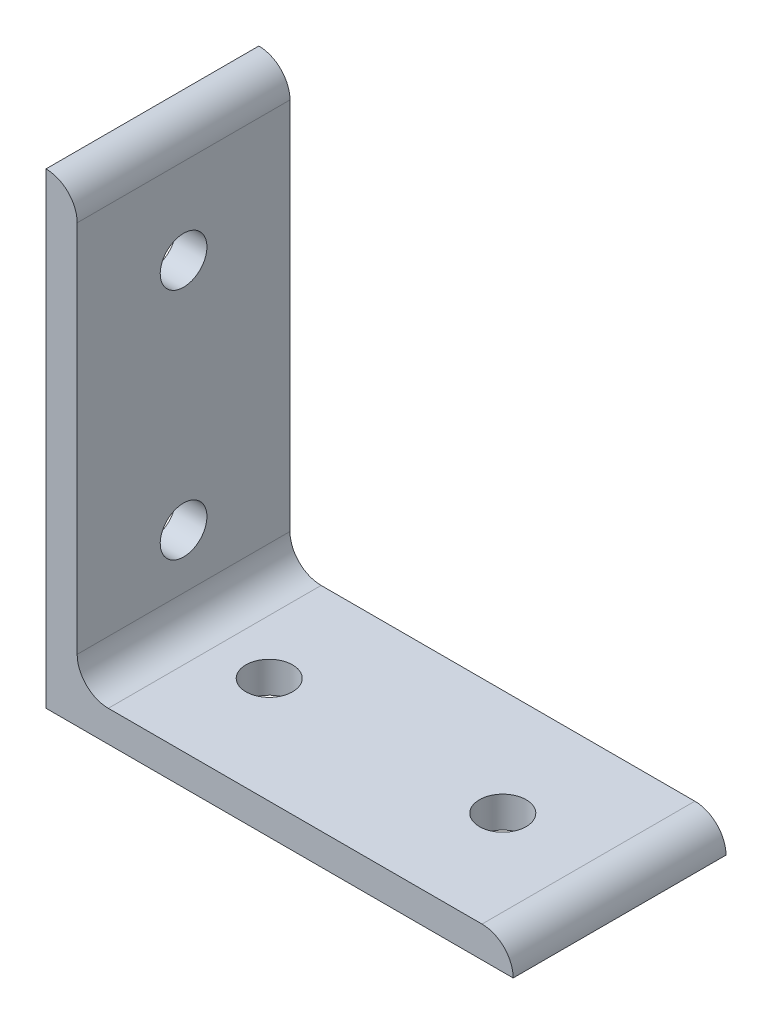
ISO-10303-21;
HEADER;
FILE_DESCRIPTION(('STEP AP214'),'2;1');
FILE_NAME('part.step','',(''),(''),'','','');
FILE_SCHEMA(('AUTOMOTIVE_DESIGN { 1 0 10303 214 1 1 1 1 }'));
ENDSEC;
DATA;
#1=APPLICATION_CONTEXT('core data for automotive mechanical design processes');
#2=APPLICATION_PROTOCOL_DEFINITION('international standard','automotive_design',2000,#1);
#3=PRODUCT_CONTEXT('',#1,'mechanical');
#4=PRODUCT('Part','Part','',(#3));
#5=PRODUCT_RELATED_PRODUCT_CATEGORY('part','',(#4));
#6=PRODUCT_DEFINITION_FORMATION('','',#4);
#7=PRODUCT_DEFINITION_CONTEXT('part definition',#1,'design');
#8=PRODUCT_DEFINITION('design','',#6,#7);
#9=PRODUCT_DEFINITION_SHAPE('','',#8);
#10=(LENGTH_UNIT() NAMED_UNIT(*) SI_UNIT(.MILLI.,.METRE.));
#11=(NAMED_UNIT(*) PLANE_ANGLE_UNIT() SI_UNIT($,.RADIAN.));
#12=(NAMED_UNIT(*) SI_UNIT($,.STERADIAN.) SOLID_ANGLE_UNIT());
#13=UNCERTAINTY_MEASURE_WITH_UNIT(LENGTH_MEASURE(1.E-05),#10,'distance_accuracy_value','');
#14=(GEOMETRIC_REPRESENTATION_CONTEXT(3) GLOBAL_UNCERTAINTY_ASSIGNED_CONTEXT((#13)) GLOBAL_UNIT_ASSIGNED_CONTEXT((#10,
#11,#12)) REPRESENTATION_CONTEXT('',''));
#15=CARTESIAN_POINT('',(0.,0.,0.));
#16=DIRECTION('',(0.,0.,1.));
#17=DIRECTION('',(1.,0.,0.));
#18=AXIS2_PLACEMENT_3D('',#15,#16,#17);
#19=CARTESIAN_POINT('',(5.99999999999999,84.,20.5));
#20=DIRECTION('',(-1.,0.,0.));
#21=DIRECTION('',(0.,-1.,0.));
#22=AXIS2_PLACEMENT_3D('',#19,#20,#21);
#23=PLANE('',#22);
#24=CARTESIAN_POINT('',(6.00000000000001,22.5,0.));
#25=DIRECTION('',(-1.,0.,0.));
#26=DIRECTION('',(0.,-1.,0.));
#27=AXIS2_PLACEMENT_3D('',#24,#25,#26);
#28=CIRCLE('',#27,4.5);
#29=CARTESIAN_POINT('',(6.00000000000001,18.,0.));
#30=VERTEX_POINT('',#29);
#31=EDGE_CURVE('E198',#30,#30,#28,.F.);
#32=ORIENTED_EDGE('',*,*,#31,.F.);
#33=EDGE_LOOP('',(#32));
#34=FACE_BOUND('',#33,.T.);
#35=DIRECTION('',(0.,1.,0.));
#36=VECTOR('',#35,1.);
#37=CARTESIAN_POINT('',(5.99999999999999,84.,-20.5));
#38=LINE('',#37,#36);
#39=CARTESIAN_POINT('',(6.,12.,-20.5));
#40=VERTEX_POINT('',#39);
#41=CARTESIAN_POINT('',(5.99999999999997,84.,-20.5));
#42=VERTEX_POINT('',#41);
#43=EDGE_CURVE('E119',#40,#42,#38,.T.);
#44=ORIENTED_EDGE('',*,*,#43,.T.);
#45=DIRECTION('',(0.,0.,-1.));
#46=VECTOR('',#45,1.);
#47=CARTESIAN_POINT('',(5.99999999999997,84.,20.5));
#48=LINE('',#47,#46);
#49=CARTESIAN_POINT('',(5.99999999999997,84.,20.5));
#50=VERTEX_POINT('',#49);
#51=EDGE_CURVE('E116',#50,#42,#48,.T.);
#52=ORIENTED_EDGE('',*,*,#51,.F.);
#53=DIRECTION('',(0.,1.,0.));
#54=VECTOR('',#53,1.);
#55=CARTESIAN_POINT('',(5.99999999999999,84.,20.5));
#56=LINE('',#55,#54);
#57=CARTESIAN_POINT('',(6.,12.,20.5));
#58=VERTEX_POINT('',#57);
#59=EDGE_CURVE('E105',#58,#50,#56,.T.);
#60=ORIENTED_EDGE('',*,*,#59,.F.);
#61=DIRECTION('',(0.,0.,-1.));
#62=VECTOR('',#61,1.);
#63=CARTESIAN_POINT('',(6.,12.,20.5));
#64=LINE('',#63,#62);
#65=EDGE_CURVE('E120',#58,#40,#64,.T.);
#66=ORIENTED_EDGE('',*,*,#65,.T.);
#67=EDGE_LOOP('',(#44,#52,#60,#66));
#68=FACE_BOUND('',#67,.T.);
#69=CARTESIAN_POINT('',(5.99999999999999,67.5,0.));
#70=DIRECTION('',(-1.,0.,0.));
#71=DIRECTION('',(0.,-1.,0.));
#72=AXIS2_PLACEMENT_3D('',#69,#70,#71);
#73=CIRCLE('',#72,4.5);
#74=CARTESIAN_POINT('',(5.99999999999999,63.,0.));
#75=VERTEX_POINT('',#74);
#76=EDGE_CURVE('E191',#75,#75,#73,.F.);
#77=ORIENTED_EDGE('',*,*,#76,.F.);
#78=EDGE_LOOP('',(#77));
#79=FACE_BOUND('',#78,.T.);
#80=ADVANCED_FACE('F36',(#34,#68,#79),#23,.F.);
#81=CARTESIAN_POINT('',(0.,0.,20.5));
#82=DIRECTION('',(1.,0.,0.));
#83=DIRECTION('',(0.,0.,-1.));
#84=AXIS2_PLACEMENT_3D('',#81,#82,#83);
#85=PLANE('',#84);
#86=CARTESIAN_POINT('',(0.,22.5,0.));
#87=DIRECTION('',(1.,0.,0.));
#88=DIRECTION('',(0.,0.,-1.));
#89=AXIS2_PLACEMENT_3D('',#86,#87,#88);
#90=CIRCLE('',#89,4.5);
#91=CARTESIAN_POINT('',(0.,22.5,-4.5));
#92=VERTEX_POINT('',#91);
#93=EDGE_CURVE('E194',#92,#92,#90,.T.);
#94=ORIENTED_EDGE('',*,*,#93,.T.);
#95=EDGE_LOOP('',(#94));
#96=FACE_BOUND('',#95,.T.);
#97=DIRECTION('',(0.,-1.,0.));
#98=VECTOR('',#97,1.);
#99=CARTESIAN_POINT('',(0.,0.,-20.5));
#100=LINE('',#99,#98);
#101=CARTESIAN_POINT('',(0.,90.,-20.5));
#102=VERTEX_POINT('',#101);
#103=CARTESIAN_POINT('',(0.,0.,-20.5));
#104=VERTEX_POINT('',#103);
#105=EDGE_CURVE('E87',#102,#104,#100,.T.);
#106=ORIENTED_EDGE('',*,*,#105,.T.);
#107=DIRECTION('',(0.,0.,-1.));
#108=VECTOR('',#107,1.);
#109=CARTESIAN_POINT('',(0.,0.,20.5));
#110=LINE('',#109,#108);
#111=CARTESIAN_POINT('',(0.,0.,20.5));
#112=VERTEX_POINT('',#111);
#113=EDGE_CURVE('E125',#112,#104,#110,.T.);
#114=ORIENTED_EDGE('',*,*,#113,.F.);
#115=DIRECTION('',(0.,-1.,0.));
#116=VECTOR('',#115,1.);
#117=CARTESIAN_POINT('',(0.,0.,20.5));
#118=LINE('',#117,#116);
#119=CARTESIAN_POINT('',(0.,90.,20.5));
#120=VERTEX_POINT('',#119);
#121=EDGE_CURVE('E55',#120,#112,#118,.T.);
#122=ORIENTED_EDGE('',*,*,#121,.F.);
#123=DIRECTION('',(0.,0.,-1.));
#124=VECTOR('',#123,1.);
#125=CARTESIAN_POINT('',(0.,90.,20.5));
#126=LINE('',#125,#124);
#127=EDGE_CURVE('E121',#120,#102,#126,.T.);
#128=ORIENTED_EDGE('',*,*,#127,.T.);
#129=EDGE_LOOP('',(#106,#114,#122,#128));
#130=FACE_BOUND('',#129,.T.);
#131=CARTESIAN_POINT('',(0.,67.5,0.));
#132=DIRECTION('',(1.,0.,0.));
#133=DIRECTION('',(0.,0.,-1.));
#134=AXIS2_PLACEMENT_3D('',#131,#132,#133);
#135=CIRCLE('',#134,4.5);
#136=CARTESIAN_POINT('',(0.,67.5,-4.5));
#137=VERTEX_POINT('',#136);
#138=EDGE_CURVE('E189',#137,#137,#135,.T.);
#139=ORIENTED_EDGE('',*,*,#138,.T.);
#140=EDGE_LOOP('',(#139));
#141=FACE_BOUND('',#140,.T.);
#142=ADVANCED_FACE('F182',(#96,#130,#141),#85,.F.);
#143=CARTESIAN_POINT('',(90.,0.,20.5));
#144=DIRECTION('',(0.,1.,0.));
#145=DIRECTION('',(-1.,0.,0.));
#146=AXIS2_PLACEMENT_3D('',#143,#144,#145);
#147=PLANE('',#146);
#148=CARTESIAN_POINT('',(22.5,0.,0.));
#149=DIRECTION('',(0.,1.,0.));
#150=DIRECTION('',(0.,0.,1.));
#151=AXIS2_PLACEMENT_3D('',#148,#149,#150);
#152=CIRCLE('',#151,4.5);
#153=CARTESIAN_POINT('',(22.5,0.,-4.5));
#154=VERTEX_POINT('',#153);
#155=EDGE_CURVE('E151',#154,#154,#152,.T.);
#156=ORIENTED_EDGE('',*,*,#155,.T.);
#157=EDGE_LOOP('',(#156));
#158=FACE_BOUND('',#157,.T.);
#159=DIRECTION('',(1.,0.,0.));
#160=VECTOR('',#159,1.);
#161=CARTESIAN_POINT('',(90.,0.,-20.5));
#162=LINE('',#161,#160);
#163=CARTESIAN_POINT('',(90.,0.,-20.5));
#164=VERTEX_POINT('',#163);
#165=EDGE_CURVE('E129',#104,#164,#162,.T.);
#166=ORIENTED_EDGE('',*,*,#165,.T.);
#167=DIRECTION('',(0.,0.,-1.));
#168=VECTOR('',#167,1.);
#169=CARTESIAN_POINT('',(90.,0.,20.5));
#170=LINE('',#169,#168);
#171=CARTESIAN_POINT('',(90.,0.,20.5));
#172=VERTEX_POINT('',#171);
#173=EDGE_CURVE('E11',#172,#164,#170,.T.);
#174=ORIENTED_EDGE('',*,*,#173,.F.);
#175=DIRECTION('',(1.,0.,0.));
#176=VECTOR('',#175,1.);
#177=CARTESIAN_POINT('',(90.,0.,20.5));
#178=LINE('',#177,#176);
#179=EDGE_CURVE('E142',#112,#172,#178,.T.);
#180=ORIENTED_EDGE('',*,*,#179,.F.);
#181=ORIENTED_EDGE('',*,*,#113,.T.);
#182=EDGE_LOOP('',(#166,#174,#180,#181));
#183=FACE_BOUND('',#182,.T.);
#184=CARTESIAN_POINT('',(67.5,0.,0.));
#185=DIRECTION('',(0.,1.,0.));
#186=DIRECTION('',(0.,0.,1.));
#187=AXIS2_PLACEMENT_3D('',#184,#185,#186);
#188=CIRCLE('',#187,4.5);
#189=CARTESIAN_POINT('',(67.5,0.,-4.5));
#190=VERTEX_POINT('',#189);
#191=EDGE_CURVE('E159',#190,#190,#188,.T.);
#192=ORIENTED_EDGE('',*,*,#191,.T.);
#193=EDGE_LOOP('',(#192));
#194=FACE_BOUND('',#193,.T.);
#195=ADVANCED_FACE('F38',(#158,#183,#194),#147,.F.);
#196=CARTESIAN_POINT('',(12.,6.00000000000001,20.5));
#197=DIRECTION('',(0.,-1.,0.));
#198=DIRECTION('',(1.,0.,0.));
#199=AXIS2_PLACEMENT_3D('',#196,#197,#198);
#200=PLANE('',#199);
#201=CARTESIAN_POINT('',(22.5,6.00000000000001,0.));
#202=DIRECTION('',(0.,-1.,0.));
#203=DIRECTION('',(1.,0.,0.));
#204=AXIS2_PLACEMENT_3D('',#201,#202,#203);
#205=CIRCLE('',#204,4.5);
#206=CARTESIAN_POINT('',(22.5,6.00000000000001,-4.5));
#207=VERTEX_POINT('',#206);
#208=EDGE_CURVE('E133',#207,#207,#205,.F.);
#209=ORIENTED_EDGE('',*,*,#208,.F.);
#210=EDGE_LOOP('',(#209));
#211=FACE_BOUND('',#210,.T.);
#212=DIRECTION('',(-1.,0.,0.));
#213=VECTOR('',#212,1.);
#214=CARTESIAN_POINT('',(12.,6.00000000000001,-20.5));
#215=LINE('',#214,#213);
#216=CARTESIAN_POINT('',(84.,6.00000000000001,-20.5));
#217=VERTEX_POINT('',#216);
#218=CARTESIAN_POINT('',(12.,6.00000000000001,-20.5));
#219=VERTEX_POINT('',#218);
#220=EDGE_CURVE('E135',#217,#219,#215,.T.);
#221=ORIENTED_EDGE('',*,*,#220,.T.);
#222=DIRECTION('',(0.,0.,-1.));
#223=VECTOR('',#222,1.);
#224=CARTESIAN_POINT('',(12.,6.00000000000001,20.5));
#225=LINE('',#224,#223);
#226=CARTESIAN_POINT('',(12.,6.00000000000001,20.5));
#227=VERTEX_POINT('',#226);
#228=EDGE_CURVE('E146',#227,#219,#225,.T.);
#229=ORIENTED_EDGE('',*,*,#228,.F.);
#230=DIRECTION('',(-1.,0.,0.));
#231=VECTOR('',#230,1.);
#232=CARTESIAN_POINT('',(12.,6.00000000000001,20.5));
#233=LINE('',#232,#231);
#234=CARTESIAN_POINT('',(84.,6.00000000000001,20.5));
#235=VERTEX_POINT('',#234);
#236=EDGE_CURVE('E165',#235,#227,#233,.T.);
#237=ORIENTED_EDGE('',*,*,#236,.F.);
#238=DIRECTION('',(0.,0.,-1.));
#239=VECTOR('',#238,1.);
#240=CARTESIAN_POINT('',(84.,6.00000000000001,20.5));
#241=LINE('',#240,#239);
#242=EDGE_CURVE('E46',#235,#217,#241,.T.);
#243=ORIENTED_EDGE('',*,*,#242,.T.);
#244=EDGE_LOOP('',(#221,#229,#237,#243));
#245=FACE_BOUND('',#244,.T.);
#246=CARTESIAN_POINT('',(67.5,6.00000000000001,0.));
#247=DIRECTION('',(0.,-1.,0.));
#248=DIRECTION('',(1.,0.,0.));
#249=AXIS2_PLACEMENT_3D('',#246,#247,#248);
#250=CIRCLE('',#249,4.5);
#251=CARTESIAN_POINT('',(67.5,6.00000000000001,-4.5));
#252=VERTEX_POINT('',#251);
#253=EDGE_CURVE('E40',#252,#252,#250,.F.);
#254=ORIENTED_EDGE('',*,*,#253,.F.);
#255=EDGE_LOOP('',(#254));
#256=FACE_BOUND('',#255,.T.);
#257=ADVANCED_FACE('F169',(#211,#245,#256),#200,.F.);
#258=CARTESIAN_POINT('',(84.,0.,20.5));
#259=DIRECTION('',(0.,0.,-1.));
#260=DIRECTION('',(-1.,0.,0.));
#261=AXIS2_PLACEMENT_3D('',#258,#259,#260);
#262=CYLINDRICAL_SURFACE('',#261,5.99999999999998);
#263=CARTESIAN_POINT('',(84.,0.,-20.5));
#264=DIRECTION('',(0.,0.,1.));
#265=DIRECTION('',(1.,0.,0.));
#266=AXIS2_PLACEMENT_3D('',#263,#264,#265);
#267=CIRCLE('',#266,5.99999999999998);
#268=EDGE_CURVE('E132',#164,#217,#267,.T.);
#269=ORIENTED_EDGE('',*,*,#268,.T.);
#270=ORIENTED_EDGE('',*,*,#242,.F.);
#271=CARTESIAN_POINT('',(84.,0.,20.5));
#272=DIRECTION('',(0.,0.,1.));
#273=DIRECTION('',(1.,0.,0.));
#274=AXIS2_PLACEMENT_3D('',#271,#272,#273);
#275=CIRCLE('',#274,5.99999999999998);
#276=EDGE_CURVE('E95',#172,#235,#275,.T.);
#277=ORIENTED_EDGE('',*,*,#276,.F.);
#278=ORIENTED_EDGE('',*,*,#173,.T.);
#279=EDGE_LOOP('',(#269,#270,#277,#278));
#280=FACE_BOUND('',#279,.T.);
#281=ADVANCED_FACE('F213',(#280),#262,.T.);
#282=CARTESIAN_POINT('',(12.,12.,20.5));
#283=DIRECTION('',(0.,0.,-1.));
#284=DIRECTION('',(-1.,0.,0.));
#285=AXIS2_PLACEMENT_3D('',#282,#283,#284);
#286=CYLINDRICAL_SURFACE('',#285,6.);
#287=CARTESIAN_POINT('',(12.,12.,-20.5));
#288=DIRECTION('',(0.,0.,-1.));
#289=DIRECTION('',(1.,0.,0.));
#290=AXIS2_PLACEMENT_3D('',#287,#288,#289);
#291=CIRCLE('',#290,6.);
#292=EDGE_CURVE('E137',#219,#40,#291,.T.);
#293=ORIENTED_EDGE('',*,*,#292,.T.);
#294=ORIENTED_EDGE('',*,*,#65,.F.);
#295=CARTESIAN_POINT('',(12.,12.,20.5));
#296=DIRECTION('',(0.,0.,-1.));
#297=DIRECTION('',(1.,0.,0.));
#298=AXIS2_PLACEMENT_3D('',#295,#296,#297);
#299=CIRCLE('',#298,6.);
#300=EDGE_CURVE('E111',#227,#58,#299,.T.);
#301=ORIENTED_EDGE('',*,*,#300,.F.);
#302=ORIENTED_EDGE('',*,*,#228,.T.);
#303=EDGE_LOOP('',(#293,#294,#301,#302));
#304=FACE_BOUND('',#303,.T.);
#305=ADVANCED_FACE('F174',(#304),#286,.F.);
#306=CARTESIAN_POINT('',(0.,84.,20.5));
#307=DIRECTION('',(0.,0.,-1.));
#308=DIRECTION('',(-1.,0.,0.));
#309=AXIS2_PLACEMENT_3D('',#306,#307,#308);
#310=CYLINDRICAL_SURFACE('',#309,5.99999999999998);
#311=CARTESIAN_POINT('',(0.,84.,-20.5));
#312=DIRECTION('',(0.,0.,1.));
#313=DIRECTION('',(1.,0.,0.));
#314=AXIS2_PLACEMENT_3D('',#311,#312,#313);
#315=CIRCLE('',#314,5.99999999999998);
#316=EDGE_CURVE('E81',#42,#102,#315,.T.);
#317=ORIENTED_EDGE('',*,*,#316,.T.);
#318=ORIENTED_EDGE('',*,*,#127,.F.);
#319=CARTESIAN_POINT('',(0.,84.,20.5));
#320=DIRECTION('',(0.,0.,1.));
#321=DIRECTION('',(1.,0.,0.));
#322=AXIS2_PLACEMENT_3D('',#319,#320,#321);
#323=CIRCLE('',#322,5.99999999999998);
#324=EDGE_CURVE('E109',#50,#120,#323,.T.);
#325=ORIENTED_EDGE('',*,*,#324,.F.);
#326=ORIENTED_EDGE('',*,*,#51,.T.);
#327=EDGE_LOOP('',(#317,#318,#325,#326));
#328=FACE_BOUND('',#327,.T.);
#329=ADVANCED_FACE('F123',(#328),#310,.T.);
#330=CARTESIAN_POINT('',(0.,84.,20.5));
#331=DIRECTION('',(0.,0.,1.));
#332=DIRECTION('',(1.,0.,0.));
#333=AXIS2_PLACEMENT_3D('',#330,#331,#332);
#334=PLANE('',#333);
#335=ORIENTED_EDGE('',*,*,#179,.T.);
#336=ORIENTED_EDGE('',*,*,#276,.T.);
#337=ORIENTED_EDGE('',*,*,#236,.T.);
#338=ORIENTED_EDGE('',*,*,#300,.T.);
#339=ORIENTED_EDGE('',*,*,#59,.T.);
#340=ORIENTED_EDGE('',*,*,#324,.T.);
#341=ORIENTED_EDGE('',*,*,#121,.T.);
#342=EDGE_LOOP('',(#335,#336,#337,#338,#339,#340,#341));
#343=FACE_BOUND('',#342,.T.);
#344=ADVANCED_FACE('F107',(#343),#334,.T.);
#345=CARTESIAN_POINT('',(0.,84.,-20.5));
#346=DIRECTION('',(0.,0.,1.));
#347=DIRECTION('',(1.,0.,0.));
#348=AXIS2_PLACEMENT_3D('',#345,#346,#347);
#349=PLANE('',#348);
#350=ORIENTED_EDGE('',*,*,#165,.F.);
#351=ORIENTED_EDGE('',*,*,#105,.F.);
#352=ORIENTED_EDGE('',*,*,#316,.F.);
#353=ORIENTED_EDGE('',*,*,#43,.F.);
#354=ORIENTED_EDGE('',*,*,#292,.F.);
#355=ORIENTED_EDGE('',*,*,#220,.F.);
#356=ORIENTED_EDGE('',*,*,#268,.F.);
#357=EDGE_LOOP('',(#350,#351,#352,#353,#354,#355,#356));
#358=FACE_BOUND('',#357,.T.);
#359=ADVANCED_FACE('F177',(#358),#349,.F.);
#360=CARTESIAN_POINT('',(22.5,90.,0.));
#361=DIRECTION('',(0.,-1.,0.));
#362=DIRECTION('',(0.,0.,-1.));
#363=AXIS2_PLACEMENT_3D('',#360,#361,#362);
#364=CYLINDRICAL_SURFACE('',#363,4.5);
#365=CARTESIAN_POINT('',(22.5,0.,-4.5));
#366=CARTESIAN_POINT('',(22.5,0.0625000000000024,-4.5));
#367=CARTESIAN_POINT('',(22.5,0.125000000000005,-4.5));
#368=CARTESIAN_POINT('',(22.5,0.250000000000005,-4.5));
#369=CARTESIAN_POINT('',(22.5,0.312500000000003,-4.5));
#370=CARTESIAN_POINT('',(22.5,0.437499999999998,-4.5));
#371=CARTESIAN_POINT('',(22.5,0.499999999999996,-4.5));
#372=CARTESIAN_POINT('',(22.5,0.624999999999996,-4.5));
#373=CARTESIAN_POINT('',(22.5,0.687499999999998,-4.5));
#374=CARTESIAN_POINT('',(22.5,0.812500000000003,-4.5));
#375=CARTESIAN_POINT('',(22.5,0.875000000000005,-4.5));
#376=CARTESIAN_POINT('',(22.5,1.00000000000001,-4.5));
#377=CARTESIAN_POINT('',(22.5,1.0625,-4.5));
#378=CARTESIAN_POINT('',(22.5,1.1875,-4.5));
#379=CARTESIAN_POINT('',(22.5,1.25,-4.5));
#380=CARTESIAN_POINT('',(22.5,1.375,-4.5));
#381=CARTESIAN_POINT('',(22.5,1.4375,-4.5));
#382=CARTESIAN_POINT('',(22.5,1.5625,-4.5));
#383=CARTESIAN_POINT('',(22.5,1.62500000000001,-4.5));
#384=CARTESIAN_POINT('',(22.5,1.75000000000001,-4.5));
#385=CARTESIAN_POINT('',(22.5,1.8125,-4.5));
#386=CARTESIAN_POINT('',(22.5,1.9375,-4.5));
#387=CARTESIAN_POINT('',(22.5,2.,-4.5));
#388=CARTESIAN_POINT('',(22.5,2.125,-4.5));
#389=CARTESIAN_POINT('',(22.5,2.1875,-4.5));
#390=CARTESIAN_POINT('',(22.5,2.3125,-4.5));
#391=CARTESIAN_POINT('',(22.5,2.37500000000001,-4.5));
#392=CARTESIAN_POINT('',(22.5,2.50000000000001,-4.5));
#393=CARTESIAN_POINT('',(22.5,2.5625,-4.5));
#394=CARTESIAN_POINT('',(22.5,2.6875,-4.5));
#395=CARTESIAN_POINT('',(22.5,2.75,-4.5));
#396=CARTESIAN_POINT('',(22.5,2.875,-4.5));
#397=CARTESIAN_POINT('',(22.5,2.9375,-4.5));
#398=CARTESIAN_POINT('',(22.5,3.0625,-4.5));
#399=CARTESIAN_POINT('',(22.5,3.12500000000001,-4.5));
#400=CARTESIAN_POINT('',(22.5,3.25000000000001,-4.5));
#401=CARTESIAN_POINT('',(22.5,3.31250000000001,-4.5));
#402=CARTESIAN_POINT('',(22.5,3.4375,-4.5));
#403=CARTESIAN_POINT('',(22.5,3.5,-4.5));
#404=CARTESIAN_POINT('',(22.5,3.625,-4.5));
#405=CARTESIAN_POINT('',(22.5,3.6875,-4.5));
#406=CARTESIAN_POINT('',(22.5,3.81250000000001,-4.5));
#407=CARTESIAN_POINT('',(22.5,3.87500000000001,-4.5));
#408=CARTESIAN_POINT('',(22.5,4.00000000000001,-4.5));
#409=CARTESIAN_POINT('',(22.5,4.06250000000001,-4.5));
#410=CARTESIAN_POINT('',(22.5,4.1875,-4.5));
#411=CARTESIAN_POINT('',(22.5,4.25,-4.5));
#412=CARTESIAN_POINT('',(22.5,4.375,-4.5));
#413=CARTESIAN_POINT('',(22.5,4.4375,-4.5));
#414=CARTESIAN_POINT('',(22.5,4.56250000000001,-4.5));
#415=CARTESIAN_POINT('',(22.5,4.62500000000001,-4.5));
#416=CARTESIAN_POINT('',(22.5,4.75000000000001,-4.5));
#417=CARTESIAN_POINT('',(22.5,4.81250000000001,-4.5));
#418=CARTESIAN_POINT('',(22.5,4.9375,-4.5));
#419=CARTESIAN_POINT('',(22.5,5.,-4.5));
#420=CARTESIAN_POINT('',(22.5,5.125,-4.5));
#421=CARTESIAN_POINT('',(22.5,5.1875,-4.5));
#422=CARTESIAN_POINT('',(22.5,5.31250000000001,-4.5));
#423=CARTESIAN_POINT('',(22.5,5.37500000000001,-4.5));
#424=CARTESIAN_POINT('',(22.5,5.50000000000001,-4.5));
#425=CARTESIAN_POINT('',(22.5,5.56250000000001,-4.5));
#426=CARTESIAN_POINT('',(22.5,5.6875,-4.5));
#427=CARTESIAN_POINT('',(22.5,5.75,-4.5));
#428=CARTESIAN_POINT('',(22.5,5.875,-4.5));
#429=CARTESIAN_POINT('',(22.5,5.9375,-4.5));
#430=CARTESIAN_POINT('',(22.5,6.00000000000001,-4.5));
#431=B_SPLINE_CURVE_WITH_KNOTS('',3,(#365,#366,#367,#368,#369,#370,#371,#372,#373,#374,#375,
#376,#377,#378,#379,#380,#381,#382,#383,#384,#385,#386,#387,#388,#389,#390,#391,#392,#393,#394,
#395,#396,#397,#398,#399,#400,#401,#402,#403,#404,#405,#406,#407,#408,#409,#410,#411,#412,#413,
#414,#415,#416,#417,#418,#419,#420,#421,#422,#423,#424,#425,#426,#427,#428,#429,#430),
.UNSPECIFIED.,.F.,.F.,(4,2,2,2,2,2,2,2,2,2,2,2,2,2,2,2,2,2,2,2,2,2,2,2,2,2,2,2,2,2,2,2,4),(0.,
0.187500000000007,0.375,0.562499999999994,0.750000000000001,0.937500000000008,1.125,
1.31249999999999,1.5,1.68750000000001,1.875,2.06249999999999,2.25,2.43750000000001,2.625,2.8125,
3.,3.18750000000001,3.375,3.5625,3.75,3.93750000000001,4.125,4.3125,4.5,4.68750000000001,4.875,
5.0625,5.25,5.43750000000001,5.62500000000001,5.8125,6.00000000000001),.UNSPECIFIED.);
#432=EDGE_CURVE('BSEAM209',#154,#207,#431,.T.);
#433=ORIENTED_EDGE('',*,*,#155,.F.);
#434=ORIENTED_EDGE('',*,*,#208,.T.);
#435=ORIENTED_EDGE('',*,*,#432,.T.);
#436=ORIENTED_EDGE('',*,*,#432,.F.);
#437=EDGE_LOOP('',(#433,#435,#434,#436));
#438=FACE_BOUND('',#437,.T.);
#439=ADVANCED_FACE('F209',(#438),#364,.F.);
#440=CARTESIAN_POINT('',(67.5,90.,0.));
#441=DIRECTION('',(0.,-1.,0.));
#442=DIRECTION('',(0.,0.,-1.));
#443=AXIS2_PLACEMENT_3D('',#440,#441,#442);
#444=CYLINDRICAL_SURFACE('',#443,4.5);
#445=CARTESIAN_POINT('',(67.5,0.,-4.5));
#446=CARTESIAN_POINT('',(67.5,0.0625000000000024,-4.5));
#447=CARTESIAN_POINT('',(67.5,0.125000000000005,-4.5));
#448=CARTESIAN_POINT('',(67.5,0.250000000000005,-4.5));
#449=CARTESIAN_POINT('',(67.5,0.312500000000003,-4.5));
#450=CARTESIAN_POINT('',(67.5,0.437499999999998,-4.5));
#451=CARTESIAN_POINT('',(67.5,0.499999999999996,-4.5));
#452=CARTESIAN_POINT('',(67.5,0.624999999999996,-4.5));
#453=CARTESIAN_POINT('',(67.5,0.687499999999998,-4.5));
#454=CARTESIAN_POINT('',(67.5,0.812500000000003,-4.5));
#455=CARTESIAN_POINT('',(67.5,0.875000000000005,-4.5));
#456=CARTESIAN_POINT('',(67.5,1.00000000000001,-4.5));
#457=CARTESIAN_POINT('',(67.5,1.0625,-4.5));
#458=CARTESIAN_POINT('',(67.5,1.1875,-4.5));
#459=CARTESIAN_POINT('',(67.5,1.25,-4.5));
#460=CARTESIAN_POINT('',(67.5,1.375,-4.5));
#461=CARTESIAN_POINT('',(67.5,1.4375,-4.5));
#462=CARTESIAN_POINT('',(67.5,1.5625,-4.5));
#463=CARTESIAN_POINT('',(67.5,1.62500000000001,-4.5));
#464=CARTESIAN_POINT('',(67.5,1.75000000000001,-4.5));
#465=CARTESIAN_POINT('',(67.5,1.8125,-4.5));
#466=CARTESIAN_POINT('',(67.5,1.9375,-4.5));
#467=CARTESIAN_POINT('',(67.5,2.,-4.5));
#468=CARTESIAN_POINT('',(67.5,2.125,-4.5));
#469=CARTESIAN_POINT('',(67.5,2.1875,-4.5));
#470=CARTESIAN_POINT('',(67.5,2.3125,-4.5));
#471=CARTESIAN_POINT('',(67.5,2.37500000000001,-4.5));
#472=CARTESIAN_POINT('',(67.5,2.50000000000001,-4.5));
#473=CARTESIAN_POINT('',(67.5,2.5625,-4.5));
#474=CARTESIAN_POINT('',(67.5,2.6875,-4.5));
#475=CARTESIAN_POINT('',(67.5,2.75,-4.5));
#476=CARTESIAN_POINT('',(67.5,2.875,-4.5));
#477=CARTESIAN_POINT('',(67.5,2.9375,-4.5));
#478=CARTESIAN_POINT('',(67.5,3.0625,-4.5));
#479=CARTESIAN_POINT('',(67.5,3.12500000000001,-4.5));
#480=CARTESIAN_POINT('',(67.5,3.25000000000001,-4.5));
#481=CARTESIAN_POINT('',(67.5,3.31250000000001,-4.5));
#482=CARTESIAN_POINT('',(67.5,3.4375,-4.5));
#483=CARTESIAN_POINT('',(67.5,3.5,-4.5));
#484=CARTESIAN_POINT('',(67.5,3.625,-4.5));
#485=CARTESIAN_POINT('',(67.5,3.6875,-4.5));
#486=CARTESIAN_POINT('',(67.5,3.81250000000001,-4.5));
#487=CARTESIAN_POINT('',(67.5,3.87500000000001,-4.5));
#488=CARTESIAN_POINT('',(67.5,4.00000000000001,-4.5));
#489=CARTESIAN_POINT('',(67.5,4.06250000000001,-4.5));
#490=CARTESIAN_POINT('',(67.5,4.1875,-4.5));
#491=CARTESIAN_POINT('',(67.5,4.25,-4.5));
#492=CARTESIAN_POINT('',(67.5,4.375,-4.5));
#493=CARTESIAN_POINT('',(67.5,4.4375,-4.5));
#494=CARTESIAN_POINT('',(67.5,4.56250000000001,-4.5));
#495=CARTESIAN_POINT('',(67.5,4.62500000000001,-4.5));
#496=CARTESIAN_POINT('',(67.5,4.75000000000001,-4.5));
#497=CARTESIAN_POINT('',(67.5,4.81250000000001,-4.5));
#498=CARTESIAN_POINT('',(67.5,4.9375,-4.5));
#499=CARTESIAN_POINT('',(67.5,5.,-4.5));
#500=CARTESIAN_POINT('',(67.5,5.125,-4.5));
#501=CARTESIAN_POINT('',(67.5,5.1875,-4.5));
#502=CARTESIAN_POINT('',(67.5,5.31250000000001,-4.5));
#503=CARTESIAN_POINT('',(67.5,5.37500000000001,-4.5));
#504=CARTESIAN_POINT('',(67.5,5.50000000000001,-4.5));
#505=CARTESIAN_POINT('',(67.5,5.56250000000001,-4.5));
#506=CARTESIAN_POINT('',(67.5,5.6875,-4.5));
#507=CARTESIAN_POINT('',(67.5,5.75,-4.5));
#508=CARTESIAN_POINT('',(67.5,5.875,-4.5));
#509=CARTESIAN_POINT('',(67.5,5.9375,-4.5));
#510=CARTESIAN_POINT('',(67.5,6.00000000000001,-4.5));
#511=B_SPLINE_CURVE_WITH_KNOTS('',3,(#445,#446,#447,#448,#449,#450,#451,#452,#453,#454,#455,
#456,#457,#458,#459,#460,#461,#462,#463,#464,#465,#466,#467,#468,#469,#470,#471,#472,#473,#474,
#475,#476,#477,#478,#479,#480,#481,#482,#483,#484,#485,#486,#487,#488,#489,#490,#491,#492,#493,
#494,#495,#496,#497,#498,#499,#500,#501,#502,#503,#504,#505,#506,#507,#508,#509,#510),
.UNSPECIFIED.,.F.,.F.,(4,2,2,2,2,2,2,2,2,2,2,2,2,2,2,2,2,2,2,2,2,2,2,2,2,2,2,2,2,2,2,2,4),(0.,
0.187500000000007,0.375,0.562499999999994,0.750000000000001,0.937500000000008,1.125,
1.31249999999999,1.5,1.68750000000001,1.875,2.06249999999999,2.25,2.43750000000001,2.625,2.8125,
3.,3.18750000000001,3.375,3.5625,3.75,3.93750000000001,4.125,4.3125,4.5,4.68750000000001,4.875,
5.0625,5.25,5.43750000000001,5.62500000000001,5.8125,6.00000000000001),.UNSPECIFIED.);
#512=EDGE_CURVE('BSEAM205',#190,#252,#511,.T.);
#513=ORIENTED_EDGE('',*,*,#191,.F.);
#514=ORIENTED_EDGE('',*,*,#253,.T.);
#515=ORIENTED_EDGE('',*,*,#512,.T.);
#516=ORIENTED_EDGE('',*,*,#512,.F.);
#517=EDGE_LOOP('',(#513,#515,#514,#516));
#518=FACE_BOUND('',#517,.T.);
#519=ADVANCED_FACE('F205',(#518),#444,.F.);
#520=CARTESIAN_POINT('',(90.,22.5,0.));
#521=DIRECTION('',(-1.,0.,0.));
#522=DIRECTION('',(0.,0.,1.));
#523=AXIS2_PLACEMENT_3D('',#520,#521,#522);
#524=CYLINDRICAL_SURFACE('',#523,4.5);
#525=ORIENTED_EDGE('',*,*,#93,.F.);
#526=EDGE_LOOP('',(#525));
#527=FACE_BOUND('',#526,.T.);
#528=ORIENTED_EDGE('',*,*,#31,.T.);
#529=EDGE_LOOP('',(#528));
#530=FACE_BOUND('',#529,.T.);
#531=ADVANCED_FACE('F208',(#527,#530),#524,.F.);
#532=CARTESIAN_POINT('',(90.,67.5,0.));
#533=DIRECTION('',(-1.,0.,0.));
#534=DIRECTION('',(0.,0.,1.));
#535=AXIS2_PLACEMENT_3D('',#532,#533,#534);
#536=CYLINDRICAL_SURFACE('',#535,4.5);
#537=ORIENTED_EDGE('',*,*,#138,.F.);
#538=EDGE_LOOP('',(#537));
#539=FACE_BOUND('',#538,.T.);
#540=ORIENTED_EDGE('',*,*,#76,.T.);
#541=EDGE_LOOP('',(#540));
#542=FACE_BOUND('',#541,.T.);
#543=ADVANCED_FACE('F245',(#539,#542),#536,.F.);
#544=CLOSED_SHELL('',(#80,#142,#195,#257,#281,#305,#329,#344,#359,#439,#519,#531,#543));
#545=MANIFOLD_SOLID_BREP('B2',#544);
#546=ADVANCED_BREP_SHAPE_REPRESENTATION('',(#18,#545),#14);
#547=SHAPE_DEFINITION_REPRESENTATION(#9,#546);
ENDSEC;
END-ISO-10303-21;
